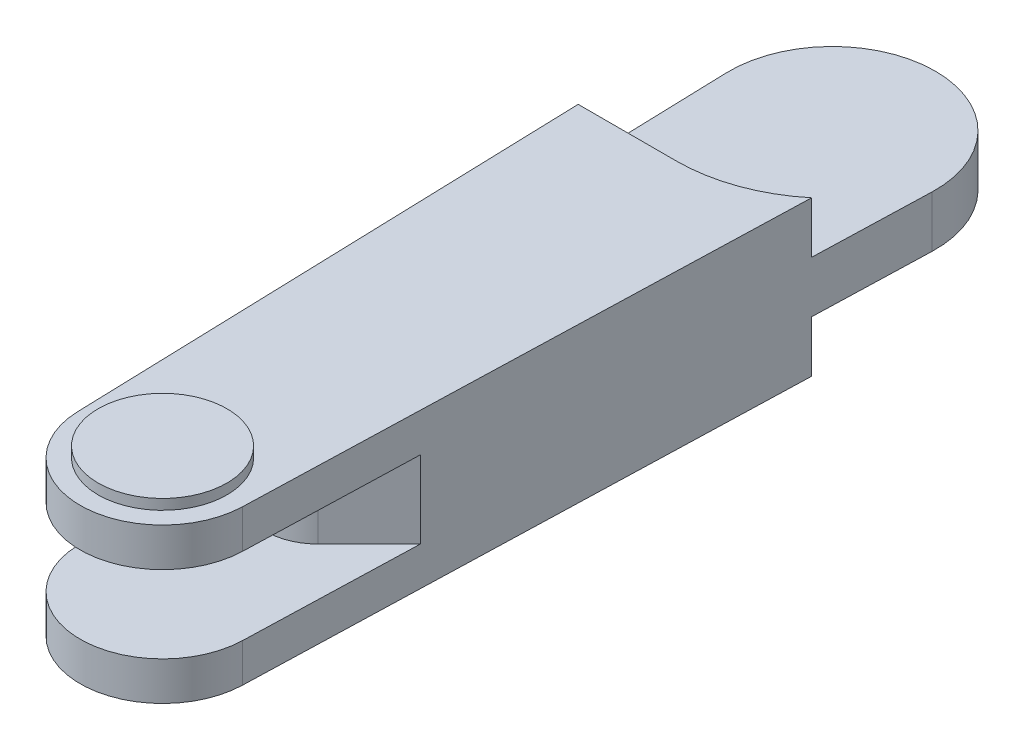
ISO-10303-21;
HEADER;
FILE_DESCRIPTION(('STEP AP214'),'2;1');
FILE_NAME('part.step','',(''),(''),'','','');
FILE_SCHEMA(('AUTOMOTIVE_DESIGN { 1 0 10303 214 1 1 1 1 }'));
ENDSEC;
DATA;
#1=APPLICATION_CONTEXT('core data for automotive mechanical design processes');
#2=APPLICATION_PROTOCOL_DEFINITION('international standard','automotive_design',2000,#1);
#3=PRODUCT_CONTEXT('',#1,'mechanical');
#4=PRODUCT('Part','Part','',(#3));
#5=PRODUCT_RELATED_PRODUCT_CATEGORY('part','',(#4));
#6=PRODUCT_DEFINITION_FORMATION('','',#4);
#7=PRODUCT_DEFINITION_CONTEXT('part definition',#1,'design');
#8=PRODUCT_DEFINITION('design','',#6,#7);
#9=PRODUCT_DEFINITION_SHAPE('','',#8);
#10=(LENGTH_UNIT() NAMED_UNIT(*) SI_UNIT(.MILLI.,.METRE.));
#11=(NAMED_UNIT(*) PLANE_ANGLE_UNIT() SI_UNIT($,.RADIAN.));
#12=(NAMED_UNIT(*) SI_UNIT($,.STERADIAN.) SOLID_ANGLE_UNIT());
#13=UNCERTAINTY_MEASURE_WITH_UNIT(LENGTH_MEASURE(1.E-05),#10,'distance_accuracy_value','');
#14=(GEOMETRIC_REPRESENTATION_CONTEXT(3) GLOBAL_UNCERTAINTY_ASSIGNED_CONTEXT((#13)) GLOBAL_UNIT_ASSIGNED_CONTEXT((#10,
#11,#12)) REPRESENTATION_CONTEXT('',''));
#15=CARTESIAN_POINT('',(0.,0.,0.));
#16=DIRECTION('',(0.,0.,1.));
#17=DIRECTION('',(1.,0.,0.));
#18=AXIS2_PLACEMENT_3D('',#15,#16,#17);
#19=CARTESIAN_POINT('',(-1.79914772722495,-1.5,0.0553846153846156));
#20=DIRECTION('',(0.999526515124971,0.,-0.0307692307692309));
#21=DIRECTION('',(-0.0307692307692309,0.,-0.999526515124972));
#22=AXIS2_PLACEMENT_3D('',#19,#20,#21);
#23=PLANE('',#22);
#24=DIRECTION('',(-0.0307692307692309,0.,-0.999526515124972));
#25=VECTOR('',#24,1.);
#26=CARTESIAN_POINT('',(-1.79914772722495,-0.5,0.0553846153846156));
#27=LINE('',#26,#25);
#28=CARTESIAN_POINT('',(-1.90782640386949,-0.5,-3.475));
#29=VERTEX_POINT('',#28);
#30=CARTESIAN_POINT('',(-1.99905303024994,-0.5,-6.43846153846154));
#31=VERTEX_POINT('',#30);
#32=EDGE_CURVE('E193',#29,#31,#27,.T.);
#33=ORIENTED_EDGE('',*,*,#32,.F.);
#34=DIRECTION('',(0.,-1.,0.));
#35=VECTOR('',#34,1.);
#36=CARTESIAN_POINT('',(-1.90782640386949,1.55060368533439,-3.475));
#37=LINE('',#36,#35);
#38=CARTESIAN_POINT('',(-1.90782640386949,-1.5,-3.475));
#39=VERTEX_POINT('',#38);
#40=EDGE_CURVE('E165',#29,#39,#37,.T.);
#41=ORIENTED_EDGE('',*,*,#40,.T.);
#42=DIRECTION('',(-0.0307692307692309,0.,-0.999526515124971));
#43=VECTOR('',#42,1.);
#44=CARTESIAN_POINT('',(-1.79914772722495,-1.5,0.0553846153846156));
#45=LINE('',#44,#43);
#46=CARTESIAN_POINT('',(-1.59924242419995,-1.5,6.54923076923077));
#47=VERTEX_POINT('',#46);
#48=EDGE_CURVE('E176',#47,#39,#45,.T.);
#49=ORIENTED_EDGE('',*,*,#48,.F.);
#50=DIRECTION('',(0.,1.,0.));
#51=VECTOR('',#50,1.);
#52=CARTESIAN_POINT('',(-1.59924242419995,-1.5,6.54923076923077));
#53=LINE('',#52,#51);
#54=CARTESIAN_POINT('',(-1.59924242419995,-0.75,6.54923076923077));
#55=VERTEX_POINT('',#54);
#56=EDGE_CURVE('E221',#47,#55,#53,.T.);
#57=ORIENTED_EDGE('',*,*,#56,.T.);
#58=DIRECTION('',(0.0307692307692309,0.,0.999526515124972));
#59=VECTOR('',#58,1.);
#60=CARTESIAN_POINT('',(-1.79914772722495,-0.75,0.0553846153846156));
#61=LINE('',#60,#59);
#62=CARTESIAN_POINT('',(-1.70241896072819,-0.75,3.19758103927181));
#63=VERTEX_POINT('',#62);
#64=EDGE_CURVE('E288',#63,#55,#61,.T.);
#65=ORIENTED_EDGE('',*,*,#64,.F.);
#66=DIRECTION('',(0.,-1.,0.));
#67=VECTOR('',#66,1.);
#68=CARTESIAN_POINT('',(-1.70241896072819,-1.5,3.19758103927181));
#69=LINE('',#68,#67);
#70=CARTESIAN_POINT('',(-1.70241896072819,0.75,3.19758103927181));
#71=VERTEX_POINT('',#70);
#72=EDGE_CURVE('E248',#71,#63,#69,.T.);
#73=ORIENTED_EDGE('',*,*,#72,.F.);
#74=DIRECTION('',(0.0307692307692309,0.,0.999526515124972));
#75=VECTOR('',#74,1.);
#76=CARTESIAN_POINT('',(-1.79914772722495,0.75,0.0553846153846156));
#77=LINE('',#76,#75);
#78=CARTESIAN_POINT('',(-1.59924242419995,0.75,6.54923076923077));
#79=VERTEX_POINT('',#78);
#80=EDGE_CURVE('E182',#71,#79,#77,.T.);
#81=ORIENTED_EDGE('',*,*,#80,.T.);
#82=CARTESIAN_POINT('',(-1.59924242419995,1.5,6.54923076923077));
#83=VERTEX_POINT('',#82);
#84=EDGE_CURVE('E225',#79,#83,#53,.T.);
#85=ORIENTED_EDGE('',*,*,#84,.T.);
#86=DIRECTION('',(-0.0307692307692309,0.,-0.999526515124971));
#87=VECTOR('',#86,1.);
#88=CARTESIAN_POINT('',(-1.79914772722495,1.5,0.0553846153846156));
#89=LINE('',#88,#87);
#90=CARTESIAN_POINT('',(-1.90782640386949,1.5,-3.475));
#91=VERTEX_POINT('',#90);
#92=EDGE_CURVE('E211',#83,#91,#89,.T.);
#93=ORIENTED_EDGE('',*,*,#92,.T.);
#94=DIRECTION('',(0.,1.,0.));
#95=VECTOR('',#94,1.);
#96=CARTESIAN_POINT('',(-1.90782640386949,-1.5,-3.475));
#97=LINE('',#96,#95);
#98=CARTESIAN_POINT('',(-1.90782640386949,0.5,-3.475));
#99=VERTEX_POINT('',#98);
#100=EDGE_CURVE('E306',#99,#91,#97,.T.);
#101=ORIENTED_EDGE('',*,*,#100,.F.);
#102=DIRECTION('',(0.0307692307692309,0.,0.999526515124972));
#103=VECTOR('',#102,1.);
#104=CARTESIAN_POINT('',(-1.79914772722495,0.5,0.0553846153846156));
#105=LINE('',#104,#103);
#106=CARTESIAN_POINT('',(-1.99905303024994,0.5,-6.43846153846154));
#107=VERTEX_POINT('',#106);
#108=EDGE_CURVE('E203',#107,#99,#105,.T.);
#109=ORIENTED_EDGE('',*,*,#108,.F.);
#110=DIRECTION('',(0.,1.,0.));
#111=VECTOR('',#110,1.);
#112=CARTESIAN_POINT('',(-1.99905303024994,-1.5,-6.43846153846154));
#113=LINE('',#112,#111);
#114=EDGE_CURVE('E226',#31,#107,#113,.T.);
#115=ORIENTED_EDGE('',*,*,#114,.F.);
#116=EDGE_LOOP('',(#33,#41,#49,#57,#65,#73,#81,#85,#93,#101,#109,#115));
#117=FACE_BOUND('',#116,.T.);
#118=ADVANCED_FACE('F39',(#117),#23,.F.);
#119=CARTESIAN_POINT('',(0.,1.5,0.));
#120=DIRECTION('',(0.,1.,0.));
#121=DIRECTION('',(0.,0.,1.));
#122=AXIS2_PLACEMENT_3D('',#119,#120,#121);
#123=PLANE('',#122);
#124=CARTESIAN_POINT('',(0.,1.5,6.5));
#125=DIRECTION('',(0.,1.,0.));
#126=DIRECTION('',(0.,0.,1.));
#127=AXIS2_PLACEMENT_3D('',#124,#125,#126);
#128=CIRCLE('',#127,1.25);
#129=CARTESIAN_POINT('',(0.,1.5,7.75));
#130=VERTEX_POINT('',#129);
#131=EDGE_CURVE('E312',#130,#130,#128,.T.);
#132=ORIENTED_EDGE('',*,*,#131,.F.);
#133=EDGE_LOOP('',(#132));
#134=FACE_BOUND('',#133,.T.);
#135=CARTESIAN_POINT('',(0.,1.5,-6.5));
#136=DIRECTION('',(0.,1.,0.));
#137=DIRECTION('',(0.,0.,1.));
#138=AXIS2_PLACEMENT_3D('',#135,#136,#137);
#139=CIRCLE('',#138,3.025);
#140=CARTESIAN_POINT('',(0.,1.5,-3.475));
#141=VERTEX_POINT('',#140);
#142=CARTESIAN_POINT('',(1.92922229660818,1.5,-4.17003726848049));
#143=VERTEX_POINT('',#142);
#144=EDGE_CURVE('E224',#141,#143,#139,.T.);
#145=ORIENTED_EDGE('',*,*,#144,.F.);
#146=DIRECTION('',(-1.,0.,0.));
#147=VECTOR('',#146,1.);
#148=CARTESIAN_POINT('',(0.,1.5,-3.475));
#149=LINE('',#148,#147);
#150=EDGE_CURVE('E303',#141,#91,#149,.T.);
#151=ORIENTED_EDGE('',*,*,#150,.T.);
#152=ORIENTED_EDGE('',*,*,#92,.F.);
#153=CARTESIAN_POINT('',(0.,1.5,6.5));
#154=DIRECTION('',(0.,1.,0.));
#155=DIRECTION('',(0.,0.,1.));
#156=AXIS2_PLACEMENT_3D('',#153,#154,#155);
#157=CIRCLE('',#156,1.6);
#158=CARTESIAN_POINT('',(1.59924242419996,1.5,6.54923076923077));
#159=VERTEX_POINT('',#158);
#160=EDGE_CURVE('E205',#83,#159,#157,.T.);
#161=ORIENTED_EDGE('',*,*,#160,.T.);
#162=DIRECTION('',(0.0307692307692307,0.,-0.999526515124971));
#163=VECTOR('',#162,1.);
#164=CARTESIAN_POINT('',(1.79914772722495,1.5,0.0553846153846152));
#165=LINE('',#164,#163);
#166=EDGE_CURVE('E208',#159,#143,#165,.T.);
#167=ORIENTED_EDGE('',*,*,#166,.T.);
#168=EDGE_LOOP('',(#145,#151,#152,#161,#167));
#169=FACE_BOUND('',#168,.T.);
#170=ADVANCED_FACE('F302',(#134,#169),#123,.T.);
#171=CARTESIAN_POINT('',(0.,0.5,-6.5));
#172=DIRECTION('',(0.,1.,0.));
#173=DIRECTION('',(0.,0.,1.));
#174=AXIS2_PLACEMENT_3D('',#171,#172,#173);
#175=CYLINDRICAL_SURFACE('',#174,3.025);
#176=DIRECTION('',(0.,1.,0.));
#177=VECTOR('',#176,1.);
#178=CARTESIAN_POINT('',(0.,-4.35823083376106,-3.475));
#179=LINE('',#178,#177);
#180=CARTESIAN_POINT('',(0.,0.5,-3.475));
#181=VERTEX_POINT('',#180);
#182=EDGE_CURVE('E54',#181,#141,#179,.T.);
#183=ORIENTED_EDGE('',*,*,#182,.T.);
#184=ORIENTED_EDGE('',*,*,#144,.T.);
#185=DIRECTION('',(0.,1.,0.));
#186=VECTOR('',#185,1.);
#187=CARTESIAN_POINT('',(1.92922229660818,0.5,-4.17003726848049));
#188=LINE('',#187,#186);
#189=CARTESIAN_POINT('',(1.92922229660818,0.5,-4.17003726848049));
#190=VERTEX_POINT('',#189);
#191=EDGE_CURVE('E197',#143,#190,#188,.F.);
#192=ORIENTED_EDGE('',*,*,#191,.T.);
#193=CARTESIAN_POINT('',(0.,0.5,-6.5));
#194=DIRECTION('',(0.,1.,0.));
#195=DIRECTION('',(0.,0.,1.));
#196=AXIS2_PLACEMENT_3D('',#193,#194,#195);
#197=CIRCLE('',#196,3.025);
#198=EDGE_CURVE('E195',#181,#190,#197,.T.);
#199=ORIENTED_EDGE('',*,*,#198,.F.);
#200=EDGE_LOOP('',(#183,#184,#192,#199));
#201=FACE_BOUND('',#200,.T.);
#202=ADVANCED_FACE('F325',(#201),#175,.F.);
#203=CARTESIAN_POINT('',(0.,-1.5,6.5));
#204=DIRECTION('',(0.,1.,0.));
#205=DIRECTION('',(0.,0.,1.));
#206=AXIS2_PLACEMENT_3D('',#203,#204,#205);
#207=CYLINDRICAL_SURFACE('',#206,1.6);
#208=DIRECTION('',(0.,1.,0.));
#209=VECTOR('',#208,1.);
#210=CARTESIAN_POINT('',(1.59924242419996,-1.5,6.54923076923077));
#211=LINE('',#210,#209);
#212=CARTESIAN_POINT('',(1.59924242419996,-1.5,6.54923076923077));
#213=VERTEX_POINT('',#212);
#214=CARTESIAN_POINT('',(1.59924242419996,-0.75,6.54923076923077));
#215=VERTEX_POINT('',#214);
#216=EDGE_CURVE('E230',#213,#215,#211,.T.);
#217=ORIENTED_EDGE('',*,*,#216,.T.);
#218=CARTESIAN_POINT('',(0.,-0.75,6.5));
#219=DIRECTION('',(0.,1.,0.));
#220=DIRECTION('',(0.,0.,1.));
#221=AXIS2_PLACEMENT_3D('',#218,#219,#220);
#222=CIRCLE('',#221,1.6);
#223=EDGE_CURVE('E285',#215,#55,#222,.F.);
#224=ORIENTED_EDGE('',*,*,#223,.T.);
#225=ORIENTED_EDGE('',*,*,#56,.F.);
#226=CARTESIAN_POINT('',(0.,-1.5,6.5));
#227=DIRECTION('',(0.,1.,0.));
#228=DIRECTION('',(0.,0.,1.));
#229=AXIS2_PLACEMENT_3D('',#226,#227,#228);
#230=CIRCLE('',#229,1.6);
#231=EDGE_CURVE('E214',#47,#213,#230,.T.);
#232=ORIENTED_EDGE('',*,*,#231,.T.);
#233=EDGE_LOOP('',(#217,#224,#225,#232));
#234=FACE_BOUND('',#233,.T.);
#235=ADVANCED_FACE('F331',(#234),#207,.T.);
#236=CARTESIAN_POINT('',(0.,-1.5,-6.5));
#237=DIRECTION('',(0.,1.,0.));
#238=DIRECTION('',(0.,0.,1.));
#239=AXIS2_PLACEMENT_3D('',#236,#237,#238);
#240=CYLINDRICAL_SURFACE('',#239,2.);
#241=DIRECTION('',(0.,1.,0.));
#242=VECTOR('',#241,1.);
#243=CARTESIAN_POINT('',(1.99905303024994,-1.5,-6.43846153846154));
#244=LINE('',#243,#242);
#245=CARTESIAN_POINT('',(1.99905303024994,-0.5,-6.43846153846154));
#246=VERTEX_POINT('',#245);
#247=CARTESIAN_POINT('',(1.99905303024994,0.5,-6.43846153846154));
#248=VERTEX_POINT('',#247);
#249=EDGE_CURVE('E228',#246,#248,#244,.T.);
#250=ORIENTED_EDGE('',*,*,#249,.F.);
#251=CARTESIAN_POINT('',(0.,-0.5,-6.5));
#252=DIRECTION('',(0.,-1.,0.));
#253=DIRECTION('',(0.,0.,-1.));
#254=AXIS2_PLACEMENT_3D('',#251,#252,#253);
#255=CIRCLE('',#254,2.);
#256=EDGE_CURVE('E190',#246,#31,#255,.F.);
#257=ORIENTED_EDGE('',*,*,#256,.T.);
#258=ORIENTED_EDGE('',*,*,#114,.T.);
#259=CARTESIAN_POINT('',(0.,0.5,-6.5));
#260=DIRECTION('',(0.,1.,0.));
#261=DIRECTION('',(0.,0.,1.));
#262=AXIS2_PLACEMENT_3D('',#259,#260,#261);
#263=CIRCLE('',#262,2.);
#264=EDGE_CURVE('E200',#107,#248,#263,.F.);
#265=ORIENTED_EDGE('',*,*,#264,.T.);
#266=EDGE_LOOP('',(#250,#257,#258,#265));
#267=FACE_BOUND('',#266,.T.);
#268=ADVANCED_FACE('F342',(#267),#240,.T.);
#269=CARTESIAN_POINT('',(0.,0.75,6.5));
#270=DIRECTION('',(0.,1.,0.));
#271=DIRECTION('',(0.,0.,1.));
#272=AXIS2_PLACEMENT_3D('',#269,#270,#271);
#273=CIRCLE('',#272,1.6);
#274=CARTESIAN_POINT('',(1.59924242419996,0.75,6.54923076923077));
#275=VERTEX_POINT('',#274);
#276=EDGE_CURVE('E186',#275,#79,#273,.F.);
#277=ORIENTED_EDGE('',*,*,#276,.F.);
#278=EDGE_CURVE('E220',#275,#159,#211,.T.);
#279=ORIENTED_EDGE('',*,*,#278,.T.);
#280=ORIENTED_EDGE('',*,*,#160,.F.);
#281=ORIENTED_EDGE('',*,*,#84,.F.);
#282=EDGE_LOOP('',(#277,#279,#280,#281));
#283=FACE_BOUND('',#282,.T.);
#284=ADVANCED_FACE('F296',(#283),#207,.T.);
#285=CARTESIAN_POINT('',(1.79914772722495,-1.5,0.0553846153846152));
#286=DIRECTION('',(0.999526515124971,0.,0.0307692307692307));
#287=DIRECTION('',(0.0307692307692307,0.,-0.999526515124972));
#288=AXIS2_PLACEMENT_3D('',#285,#286,#287);
#289=PLANE('',#288);
#290=DIRECTION('',(-0.0307692307692307,0.,0.999526515124972));
#291=VECTOR('',#290,1.);
#292=CARTESIAN_POINT('',(1.79914772722495,0.75,0.0553846153846152));
#293=LINE('',#292,#291);
#294=CARTESIAN_POINT('',(1.7024189607282,0.75,3.19758103927178));
#295=VERTEX_POINT('',#294);
#296=EDGE_CURVE('E246',#295,#275,#293,.T.);
#297=ORIENTED_EDGE('',*,*,#296,.F.);
#298=DIRECTION('',(0.,1.,0.));
#299=VECTOR('',#298,1.);
#300=CARTESIAN_POINT('',(1.7024189607282,-1.5,3.19758103927178));
#301=LINE('',#300,#299);
#302=CARTESIAN_POINT('',(1.7024189607282,-0.75,3.19758103927178));
#303=VERTEX_POINT('',#302);
#304=EDGE_CURVE('E243',#303,#295,#301,.T.);
#305=ORIENTED_EDGE('',*,*,#304,.F.);
#306=DIRECTION('',(-0.0307692307692307,0.,0.999526515124972));
#307=VECTOR('',#306,1.);
#308=CARTESIAN_POINT('',(1.79914772722495,-0.75,0.0553846153846152));
#309=LINE('',#308,#307);
#310=EDGE_CURVE('E240',#303,#215,#309,.T.);
#311=ORIENTED_EDGE('',*,*,#310,.T.);
#312=ORIENTED_EDGE('',*,*,#216,.F.);
#313=DIRECTION('',(0.0307692307692307,0.,-0.999526515124971));
#314=VECTOR('',#313,1.);
#315=CARTESIAN_POINT('',(1.79914772722495,-1.5,0.0553846153846152));
#316=LINE('',#315,#314);
#317=CARTESIAN_POINT('',(1.92922229660818,-1.5,-4.17003726848049));
#318=VERTEX_POINT('',#317);
#319=EDGE_CURVE('E217',#213,#318,#316,.T.);
#320=ORIENTED_EDGE('',*,*,#319,.T.);
#321=DIRECTION('',(0.,-1.,0.));
#322=VECTOR('',#321,1.);
#323=CARTESIAN_POINT('',(1.92922229660818,-0.5,-4.17003726848049));
#324=LINE('',#323,#322);
#325=CARTESIAN_POINT('',(1.92922229660818,-0.5,-4.17003726848049));
#326=VERTEX_POINT('',#325);
#327=EDGE_CURVE('E180',#326,#318,#324,.T.);
#328=ORIENTED_EDGE('',*,*,#327,.F.);
#329=DIRECTION('',(0.0307692307692307,0.,-0.999526515124972));
#330=VECTOR('',#329,1.);
#331=CARTESIAN_POINT('',(1.79914772722495,-0.5,0.0553846153846152));
#332=LINE('',#331,#330);
#333=EDGE_CURVE('E237',#326,#246,#332,.T.);
#334=ORIENTED_EDGE('',*,*,#333,.T.);
#335=ORIENTED_EDGE('',*,*,#249,.T.);
#336=DIRECTION('',(-0.0307692307692307,0.,0.999526515124972));
#337=VECTOR('',#336,1.);
#338=CARTESIAN_POINT('',(1.79914772722495,0.5,0.0553846153846152));
#339=LINE('',#338,#337);
#340=EDGE_CURVE('E234',#248,#190,#339,.T.);
#341=ORIENTED_EDGE('',*,*,#340,.T.);
#342=ORIENTED_EDGE('',*,*,#191,.F.);
#343=ORIENTED_EDGE('',*,*,#166,.F.);
#344=ORIENTED_EDGE('',*,*,#278,.F.);
#345=EDGE_LOOP('',(#297,#305,#311,#312,#320,#328,#334,#335,#341,#342,#343,#344));
#346=FACE_BOUND('',#345,.T.);
#347=ADVANCED_FACE('F339',(#346),#289,.T.);
#348=CARTESIAN_POINT('',(0.,-1.5,0.));
#349=DIRECTION('',(0.,1.,0.));
#350=DIRECTION('',(0.,0.,1.));
#351=AXIS2_PLACEMENT_3D('',#348,#349,#350);
#352=PLANE('',#351);
#353=CARTESIAN_POINT('',(0.,-1.5,6.5));
#354=DIRECTION('',(0.,1.,0.));
#355=DIRECTION('',(0.,0.,1.));
#356=AXIS2_PLACEMENT_3D('',#353,#354,#355);
#357=CIRCLE('',#356,1.25);
#358=CARTESIAN_POINT('',(0.,-1.5,7.75));
#359=VERTEX_POINT('',#358);
#360=EDGE_CURVE('E12',#359,#359,#357,.F.);
#361=ORIENTED_EDGE('',*,*,#360,.F.);
#362=EDGE_LOOP('',(#361));
#363=FACE_BOUND('',#362,.T.);
#364=ORIENTED_EDGE('',*,*,#48,.T.);
#365=DIRECTION('',(-1.,0.,0.));
#366=VECTOR('',#365,1.);
#367=CARTESIAN_POINT('',(0.,-1.5,-3.475));
#368=LINE('',#367,#366);
#369=CARTESIAN_POINT('',(0.,-1.5,-3.475));
#370=VERTEX_POINT('',#369);
#371=EDGE_CURVE('E157',#370,#39,#368,.T.);
#372=ORIENTED_EDGE('',*,*,#371,.F.);
#373=CARTESIAN_POINT('',(0.,-1.5,-6.5));
#374=DIRECTION('',(0.,-1.,0.));
#375=DIRECTION('',(0.,0.,-1.));
#376=AXIS2_PLACEMENT_3D('',#373,#374,#375);
#377=CIRCLE('',#376,3.025);
#378=EDGE_CURVE('E172',#318,#370,#377,.T.);
#379=ORIENTED_EDGE('',*,*,#378,.F.);
#380=ORIENTED_EDGE('',*,*,#319,.F.);
#381=ORIENTED_EDGE('',*,*,#231,.F.);
#382=EDGE_LOOP('',(#364,#372,#379,#380,#381));
#383=FACE_BOUND('',#382,.T.);
#384=ADVANCED_FACE('F170',(#363,#383),#352,.F.);
#385=CARTESIAN_POINT('',(0.,0.5,-6.5));
#386=DIRECTION('',(0.,1.,0.));
#387=DIRECTION('',(0.,0.,1.));
#388=AXIS2_PLACEMENT_3D('',#385,#386,#387);
#389=PLANE('',#388);
#390=ORIENTED_EDGE('',*,*,#108,.T.);
#391=DIRECTION('',(1.,0.,0.));
#392=VECTOR('',#391,1.);
#393=CARTESIAN_POINT('',(0.,0.5,-3.475));
#394=LINE('',#393,#392);
#395=EDGE_CURVE('E309',#99,#181,#394,.T.);
#396=ORIENTED_EDGE('',*,*,#395,.T.);
#397=ORIENTED_EDGE('',*,*,#198,.T.);
#398=ORIENTED_EDGE('',*,*,#340,.F.);
#399=ORIENTED_EDGE('',*,*,#264,.F.);
#400=EDGE_LOOP('',(#390,#396,#397,#398,#399));
#401=FACE_BOUND('',#400,.T.);
#402=ADVANCED_FACE('F338',(#401),#389,.T.);
#403=CARTESIAN_POINT('',(0.,-0.5,-6.5));
#404=DIRECTION('',(0.,-1.,0.));
#405=DIRECTION('',(0.,0.,-1.));
#406=AXIS2_PLACEMENT_3D('',#403,#404,#405);
#407=PLANE('',#406);
#408=ORIENTED_EDGE('',*,*,#32,.T.);
#409=ORIENTED_EDGE('',*,*,#256,.F.);
#410=ORIENTED_EDGE('',*,*,#333,.F.);
#411=CARTESIAN_POINT('',(0.,-0.5,-6.5));
#412=DIRECTION('',(0.,-1.,0.));
#413=DIRECTION('',(0.,0.,-1.));
#414=AXIS2_PLACEMENT_3D('',#411,#412,#413);
#415=CIRCLE('',#414,3.025);
#416=CARTESIAN_POINT('',(0.,-0.5,-3.475));
#417=VERTEX_POINT('',#416);
#418=EDGE_CURVE('E181',#326,#417,#415,.T.);
#419=ORIENTED_EDGE('',*,*,#418,.T.);
#420=DIRECTION('',(1.,0.,0.));
#421=VECTOR('',#420,1.);
#422=CARTESIAN_POINT('',(0.,-0.5,-3.475));
#423=LINE('',#422,#421);
#424=EDGE_CURVE('E160',#29,#417,#423,.T.);
#425=ORIENTED_EDGE('',*,*,#424,.F.);
#426=EDGE_LOOP('',(#408,#409,#410,#419,#425));
#427=FACE_BOUND('',#426,.T.);
#428=ADVANCED_FACE('F364',(#427),#407,.T.);
#429=CARTESIAN_POINT('',(0.,-0.5,-6.5));
#430=DIRECTION('',(0.,-1.,0.));
#431=DIRECTION('',(0.,0.,-1.));
#432=AXIS2_PLACEMENT_3D('',#429,#430,#431);
#433=CYLINDRICAL_SURFACE('',#432,3.025);
#434=ORIENTED_EDGE('',*,*,#378,.T.);
#435=DIRECTION('',(0.,-1.,0.));
#436=VECTOR('',#435,1.);
#437=CARTESIAN_POINT('',(0.,1.55060368533439,-3.475));
#438=LINE('',#437,#436);
#439=EDGE_CURVE('E153',#417,#370,#438,.T.);
#440=ORIENTED_EDGE('',*,*,#439,.F.);
#441=ORIENTED_EDGE('',*,*,#418,.F.);
#442=ORIENTED_EDGE('',*,*,#327,.T.);
#443=EDGE_LOOP('',(#434,#440,#441,#442));
#444=FACE_BOUND('',#443,.T.);
#445=ADVANCED_FACE('F178',(#444),#433,.F.);
#446=CARTESIAN_POINT('',(-2.45,0.75,2.45000000000001));
#447=DIRECTION('',(-0.707106781186546,0.,0.707106781186549));
#448=DIRECTION('',(0.707106781186549,0.,0.707106781186546));
#449=AXIS2_PLACEMENT_3D('',#446,#447,#448);
#450=PLANE('',#449);
#451=DIRECTION('',(-0.707106781186549,0.,-0.707106781186546));
#452=VECTOR('',#451,1.);
#453=CARTESIAN_POINT('',(-2.45,-0.75,2.45000000000001));
#454=LINE('',#453,#452);
#455=CARTESIAN_POINT('',(-0.707106781186551,-0.75,4.19289321881345));
#456=VERTEX_POINT('',#455);
#457=EDGE_CURVE('E270',#456,#63,#454,.T.);
#458=ORIENTED_EDGE('',*,*,#457,.F.);
#459=DIRECTION('',(0.,-1.,0.));
#460=VECTOR('',#459,1.);
#461=CARTESIAN_POINT('',(-0.707106781186551,0.75,4.19289321881345));
#462=LINE('',#461,#460);
#463=CARTESIAN_POINT('',(-0.707106781186551,0.75,4.19289321881345));
#464=VERTEX_POINT('',#463);
#465=EDGE_CURVE('E62',#456,#464,#462,.F.);
#466=ORIENTED_EDGE('',*,*,#465,.T.);
#467=DIRECTION('',(-0.707106781186549,0.,-0.707106781186546));
#468=VECTOR('',#467,1.);
#469=CARTESIAN_POINT('',(-2.45,0.75,2.45000000000001));
#470=LINE('',#469,#468);
#471=EDGE_CURVE('E262',#464,#71,#470,.T.);
#472=ORIENTED_EDGE('',*,*,#471,.T.);
#473=ORIENTED_EDGE('',*,*,#72,.T.);
#474=EDGE_LOOP('',(#458,#466,#472,#473));
#475=FACE_BOUND('',#474,.T.);
#476=ADVANCED_FACE('F276',(#475),#450,.T.);
#477=CARTESIAN_POINT('',(0.,0.75,0.));
#478=DIRECTION('',(0.,1.,0.));
#479=DIRECTION('',(0.,0.,1.));
#480=AXIS2_PLACEMENT_3D('',#477,#478,#479);
#481=PLANE('',#480);
#482=ORIENTED_EDGE('',*,*,#471,.F.);
#483=CARTESIAN_POINT('',(0.,0.75,3.4857864376269));
#484=DIRECTION('',(0.,1.,0.));
#485=DIRECTION('',(0.,0.,1.));
#486=AXIS2_PLACEMENT_3D('',#483,#484,#485);
#487=CIRCLE('',#486,1.);
#488=CARTESIAN_POINT('',(0.707106781186546,0.75,4.19289321881344));
#489=VERTEX_POINT('',#488);
#490=EDGE_CURVE('E47',#464,#489,#487,.T.);
#491=ORIENTED_EDGE('',*,*,#490,.T.);
#492=DIRECTION('',(0.707106781186544,0.,-0.707106781186551));
#493=VECTOR('',#492,1.);
#494=CARTESIAN_POINT('',(2.45,0.75,2.44999999999997));
#495=LINE('',#494,#493);
#496=EDGE_CURVE('E260',#489,#295,#495,.T.);
#497=ORIENTED_EDGE('',*,*,#496,.T.);
#498=ORIENTED_EDGE('',*,*,#296,.T.);
#499=ORIENTED_EDGE('',*,*,#276,.T.);
#500=ORIENTED_EDGE('',*,*,#80,.F.);
#501=EDGE_LOOP('',(#482,#491,#497,#498,#499,#500));
#502=FACE_BOUND('',#501,.T.);
#503=ADVANCED_FACE('F259',(#502),#481,.F.);
#504=CARTESIAN_POINT('',(0.,-0.75,0.));
#505=DIRECTION('',(0.,1.,0.));
#506=DIRECTION('',(0.,0.,1.));
#507=AXIS2_PLACEMENT_3D('',#504,#505,#506);
#508=PLANE('',#507);
#509=ORIENTED_EDGE('',*,*,#64,.T.);
#510=ORIENTED_EDGE('',*,*,#223,.F.);
#511=ORIENTED_EDGE('',*,*,#310,.F.);
#512=DIRECTION('',(0.707106781186544,0.,-0.707106781186551));
#513=VECTOR('',#512,1.);
#514=CARTESIAN_POINT('',(2.45,-0.75,2.44999999999997));
#515=LINE('',#514,#513);
#516=CARTESIAN_POINT('',(0.707106781186546,-0.75,4.19289321881344));
#517=VERTEX_POINT('',#516);
#518=EDGE_CURVE('E275',#517,#303,#515,.T.);
#519=ORIENTED_EDGE('',*,*,#518,.F.);
#520=CARTESIAN_POINT('',(0.,-0.75,3.4857864376269));
#521=DIRECTION('',(0.,1.,0.));
#522=DIRECTION('',(0.,0.,1.));
#523=AXIS2_PLACEMENT_3D('',#520,#521,#522);
#524=CIRCLE('',#523,1.);
#525=EDGE_CURVE('E255',#517,#456,#524,.F.);
#526=ORIENTED_EDGE('',*,*,#525,.T.);
#527=ORIENTED_EDGE('',*,*,#457,.T.);
#528=EDGE_LOOP('',(#509,#510,#511,#519,#526,#527));
#529=FACE_BOUND('',#528,.T.);
#530=ADVANCED_FACE('F273',(#529),#508,.T.);
#531=CARTESIAN_POINT('',(2.45,0.75,2.44999999999997));
#532=DIRECTION('',(-0.707106781186551,0.,-0.707106781186544));
#533=DIRECTION('',(-0.707106781186544,0.,0.707106781186551));
#534=AXIS2_PLACEMENT_3D('',#531,#532,#533);
#535=PLANE('',#534);
#536=ORIENTED_EDGE('',*,*,#496,.F.);
#537=DIRECTION('',(0.,-1.,0.));
#538=VECTOR('',#537,1.);
#539=CARTESIAN_POINT('',(0.707106781186546,-0.75,4.19289321881344));
#540=LINE('',#539,#538);
#541=EDGE_CURVE('E251',#489,#517,#540,.T.);
#542=ORIENTED_EDGE('',*,*,#541,.T.);
#543=ORIENTED_EDGE('',*,*,#518,.T.);
#544=ORIENTED_EDGE('',*,*,#304,.T.);
#545=EDGE_LOOP('',(#536,#542,#543,#544));
#546=FACE_BOUND('',#545,.T.);
#547=ADVANCED_FACE('F266',(#546),#535,.F.);
#548=CARTESIAN_POINT('',(0.,0.75,3.4857864376269));
#549=DIRECTION('',(0.,1.,0.));
#550=DIRECTION('',(0.,0.,1.));
#551=AXIS2_PLACEMENT_3D('',#548,#549,#550);
#552=CYLINDRICAL_SURFACE('',#551,1.);
#553=ORIENTED_EDGE('',*,*,#490,.F.);
#554=ORIENTED_EDGE('',*,*,#465,.F.);
#555=ORIENTED_EDGE('',*,*,#525,.F.);
#556=ORIENTED_EDGE('',*,*,#541,.F.);
#557=EDGE_LOOP('',(#553,#554,#555,#556));
#558=FACE_BOUND('',#557,.T.);
#559=ADVANCED_FACE('F41',(#558),#552,.T.);
#560=CARTESIAN_POINT('',(0.,1.7,6.5));
#561=DIRECTION('',(0.,-1.,0.));
#562=DIRECTION('',(0.,0.,-1.));
#563=AXIS2_PLACEMENT_3D('',#560,#561,#562);
#564=CYLINDRICAL_SURFACE('',#563,1.25);
#565=CARTESIAN_POINT('',(0.,1.7,6.5));
#566=DIRECTION('',(0.,1.,0.));
#567=DIRECTION('',(0.,0.,1.));
#568=AXIS2_PLACEMENT_3D('',#565,#566,#567);
#569=CIRCLE('',#568,1.25);
#570=CARTESIAN_POINT('',(0.,1.7,7.75));
#571=VERTEX_POINT('',#570);
#572=EDGE_CURVE('E280',#571,#571,#569,.T.);
#573=ORIENTED_EDGE('',*,*,#572,.F.);
#574=EDGE_LOOP('',(#573));
#575=FACE_BOUND('',#574,.T.);
#576=ORIENTED_EDGE('',*,*,#131,.T.);
#577=EDGE_LOOP('',(#576));
#578=FACE_BOUND('',#577,.T.);
#579=ADVANCED_FACE('F322',(#575,#578),#564,.T.);
#580=CARTESIAN_POINT('',(0.,1.7,6.5));
#581=DIRECTION('',(0.,1.,0.));
#582=DIRECTION('',(0.,0.,1.));
#583=AXIS2_PLACEMENT_3D('',#580,#581,#582);
#584=PLANE('',#583);
#585=ORIENTED_EDGE('',*,*,#572,.T.);
#586=EDGE_LOOP('',(#585));
#587=FACE_BOUND('',#586,.T.);
#588=ADVANCED_FACE('F383',(#587),#584,.T.);
#589=CARTESIAN_POINT('',(0.,-1.7,6.5));
#590=DIRECTION('',(0.,1.,0.));
#591=DIRECTION('',(0.,0.,1.));
#592=AXIS2_PLACEMENT_3D('',#589,#590,#591);
#593=CYLINDRICAL_SURFACE('',#592,1.25);
#594=CARTESIAN_POINT('',(0.,-1.7,6.5));
#595=DIRECTION('',(0.,-1.,0.));
#596=DIRECTION('',(0.,0.,-1.));
#597=AXIS2_PLACEMENT_3D('',#594,#595,#596);
#598=CIRCLE('',#597,1.25);
#599=CARTESIAN_POINT('',(0.,-1.7,5.25));
#600=VERTEX_POINT('',#599);
#601=EDGE_CURVE('E308',#600,#600,#598,.T.);
#602=ORIENTED_EDGE('',*,*,#601,.F.);
#603=EDGE_LOOP('',(#602));
#604=FACE_BOUND('',#603,.T.);
#605=ORIENTED_EDGE('',*,*,#360,.T.);
#606=EDGE_LOOP('',(#605));
#607=FACE_BOUND('',#606,.T.);
#608=ADVANCED_FACE('F387',(#604,#607),#593,.T.);
#609=CARTESIAN_POINT('',(0.,-1.7,6.5));
#610=DIRECTION('',(0.,-1.,0.));
#611=DIRECTION('',(0.,0.,-1.));
#612=AXIS2_PLACEMENT_3D('',#609,#610,#611);
#613=PLANE('',#612);
#614=ORIENTED_EDGE('',*,*,#601,.T.);
#615=EDGE_LOOP('',(#614));
#616=FACE_BOUND('',#615,.T.);
#617=ADVANCED_FACE('F391',(#616),#613,.T.);
#618=CARTESIAN_POINT('',(0.,-4.35823083376106,-3.475));
#619=DIRECTION('',(0.,0.,-1.));
#620=DIRECTION('',(-1.,0.,0.));
#621=AXIS2_PLACEMENT_3D('',#618,#619,#620);
#622=PLANE('',#621);
#623=ORIENTED_EDGE('',*,*,#100,.T.);
#624=ORIENTED_EDGE('',*,*,#150,.F.);
#625=ORIENTED_EDGE('',*,*,#182,.F.);
#626=ORIENTED_EDGE('',*,*,#395,.F.);
#627=EDGE_LOOP('',(#623,#624,#625,#626));
#628=FACE_BOUND('',#627,.T.);
#629=ADVANCED_FACE('F395',(#628),#622,.T.);
#630=CARTESIAN_POINT('',(0.,1.55060368533439,-3.475));
#631=DIRECTION('',(0.,0.,1.));
#632=DIRECTION('',(1.,0.,0.));
#633=AXIS2_PLACEMENT_3D('',#630,#631,#632);
#634=PLANE('',#633);
#635=ORIENTED_EDGE('',*,*,#424,.T.);
#636=ORIENTED_EDGE('',*,*,#439,.T.);
#637=ORIENTED_EDGE('',*,*,#371,.T.);
#638=ORIENTED_EDGE('',*,*,#40,.F.);
#639=EDGE_LOOP('',(#635,#636,#637,#638));
#640=FACE_BOUND('',#639,.T.);
#641=ADVANCED_FACE('F155',(#640),#634,.F.);
#642=CLOSED_SHELL('',(#118,#170,#202,#235,#268,#284,#347,#384,#402,#428,#445,#476,#503,#530,
#547,#559,#579,#588,#608,#617,#629,#641));
#643=MANIFOLD_SOLID_BREP('B2',#642);
#644=ADVANCED_BREP_SHAPE_REPRESENTATION('',(#18,#643),#14);
#645=SHAPE_DEFINITION_REPRESENTATION(#9,#644);
ENDSEC;
END-ISO-10303-21;
